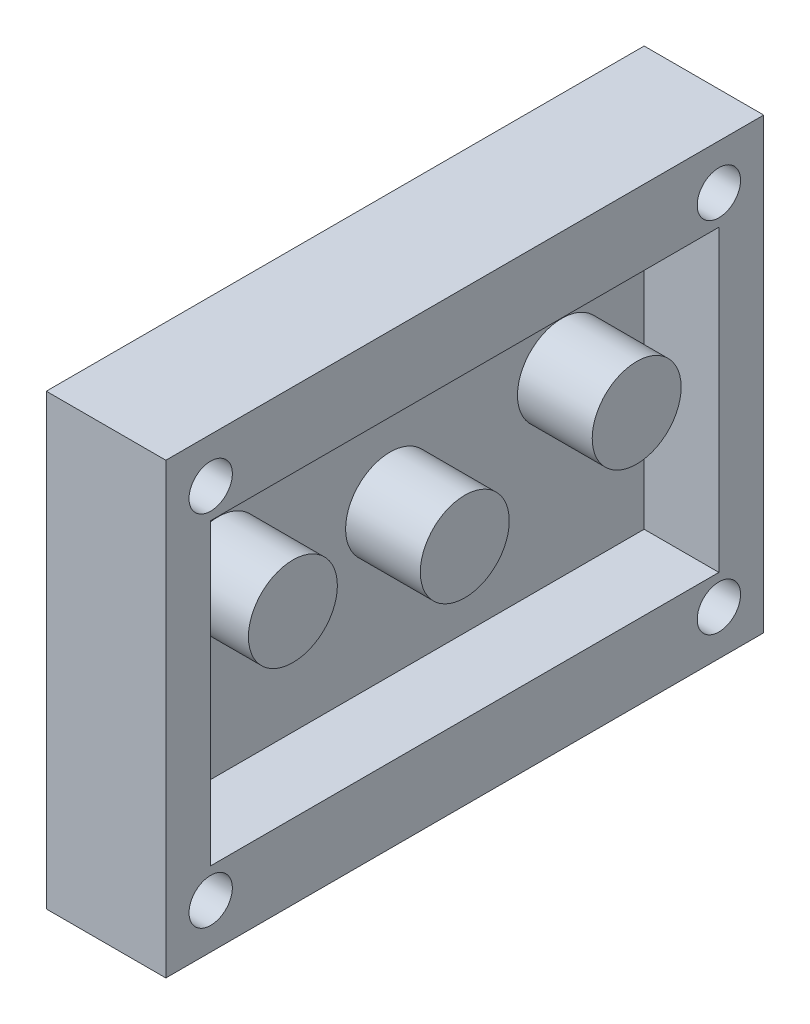
ISO-10303-21;
HEADER;
FILE_DESCRIPTION(('STEP AP214'),'2;1');
FILE_NAME('part.step','',(''),(''),'','','');
FILE_SCHEMA(('AUTOMOTIVE_DESIGN { 1 0 10303 214 1 1 1 1 }'));
ENDSEC;
DATA;
#1=APPLICATION_CONTEXT('core data for automotive mechanical design processes');
#2=APPLICATION_PROTOCOL_DEFINITION('international standard','automotive_design',2000,#1);
#3=PRODUCT_CONTEXT('',#1,'mechanical');
#4=PRODUCT('Part','Part','',(#3));
#5=PRODUCT_RELATED_PRODUCT_CATEGORY('part','',(#4));
#6=PRODUCT_DEFINITION_FORMATION('','',#4);
#7=PRODUCT_DEFINITION_CONTEXT('part definition',#1,'design');
#8=PRODUCT_DEFINITION('design','',#6,#7);
#9=PRODUCT_DEFINITION_SHAPE('','',#8);
#10=(LENGTH_UNIT() NAMED_UNIT(*) SI_UNIT(.MILLI.,.METRE.));
#11=(NAMED_UNIT(*) PLANE_ANGLE_UNIT() SI_UNIT($,.RADIAN.));
#12=(NAMED_UNIT(*) SI_UNIT($,.STERADIAN.) SOLID_ANGLE_UNIT());
#13=UNCERTAINTY_MEASURE_WITH_UNIT(LENGTH_MEASURE(1.E-05),#10,'distance_accuracy_value','');
#14=(GEOMETRIC_REPRESENTATION_CONTEXT(3) GLOBAL_UNCERTAINTY_ASSIGNED_CONTEXT((#13)) GLOBAL_UNIT_ASSIGNED_CONTEXT((#10,
#11,#12)) REPRESENTATION_CONTEXT('',''));
#15=CARTESIAN_POINT('',(0.,0.,0.));
#16=DIRECTION('',(0.,0.,1.));
#17=DIRECTION('',(1.,0.,0.));
#18=AXIS2_PLACEMENT_3D('',#15,#16,#17);
#19=CARTESIAN_POINT('',(8.,0.,0.));
#20=DIRECTION('',(0.,0.,-1.));
#21=DIRECTION('',(-1.,0.,0.));
#22=AXIS2_PLACEMENT_3D('',#19,#20,#21);
#23=PLANE('',#22);
#24=DIRECTION('',(0.,-1.,0.));
#25=VECTOR('',#24,1.);
#26=CARTESIAN_POINT('',(0.,0.,0.));
#27=LINE('',#26,#25);
#28=CARTESIAN_POINT('',(0.,30.,0.));
#29=VERTEX_POINT('',#28);
#30=CARTESIAN_POINT('',(0.,0.,0.));
#31=VERTEX_POINT('',#30);
#32=EDGE_CURVE('E152',#29,#31,#27,.T.);
#33=ORIENTED_EDGE('',*,*,#32,.T.);
#34=DIRECTION('',(-1.,0.,0.));
#35=VECTOR('',#34,1.);
#36=CARTESIAN_POINT('',(8.,0.,0.));
#37=LINE('',#36,#35);
#38=CARTESIAN_POINT('',(8.,0.,0.));
#39=VERTEX_POINT('',#38);
#40=EDGE_CURVE('E176',#39,#31,#37,.T.);
#41=ORIENTED_EDGE('',*,*,#40,.F.);
#42=DIRECTION('',(0.,-1.,0.));
#43=VECTOR('',#42,1.);
#44=CARTESIAN_POINT('',(8.,0.,0.));
#45=LINE('',#44,#43);
#46=CARTESIAN_POINT('',(8.,30.,0.));
#47=VERTEX_POINT('',#46);
#48=EDGE_CURVE('E156',#47,#39,#45,.T.);
#49=ORIENTED_EDGE('',*,*,#48,.F.);
#50=DIRECTION('',(-1.,0.,0.));
#51=VECTOR('',#50,1.);
#52=CARTESIAN_POINT('',(8.,30.,0.));
#53=LINE('',#52,#51);
#54=EDGE_CURVE('E162',#47,#29,#53,.T.);
#55=ORIENTED_EDGE('',*,*,#54,.T.);
#56=EDGE_LOOP('',(#33,#41,#49,#55));
#57=FACE_BOUND('',#56,.T.);
#58=ADVANCED_FACE('F39',(#57),#23,.F.);
#59=CARTESIAN_POINT('',(8.,0.,0.));
#60=DIRECTION('',(0.,1.,0.));
#61=DIRECTION('',(0.,0.,1.));
#62=AXIS2_PLACEMENT_3D('',#59,#60,#61);
#63=PLANE('',#62);
#64=DIRECTION('',(0.,0.,-1.));
#65=VECTOR('',#64,1.);
#66=CARTESIAN_POINT('',(0.,0.,0.));
#67=LINE('',#66,#65);
#68=CARTESIAN_POINT('',(0.,0.,-40.));
#69=VERTEX_POINT('',#68);
#70=EDGE_CURVE('E165',#31,#69,#67,.T.);
#71=ORIENTED_EDGE('',*,*,#70,.T.);
#72=DIRECTION('',(-1.,0.,0.));
#73=VECTOR('',#72,1.);
#74=CARTESIAN_POINT('',(8.,0.,-40.));
#75=LINE('',#74,#73);
#76=CARTESIAN_POINT('',(8.,0.,-40.));
#77=VERTEX_POINT('',#76);
#78=EDGE_CURVE('E173',#77,#69,#75,.T.);
#79=ORIENTED_EDGE('',*,*,#78,.F.);
#80=DIRECTION('',(0.,0.,-1.));
#81=VECTOR('',#80,1.);
#82=CARTESIAN_POINT('',(8.,0.,0.));
#83=LINE('',#82,#81);
#84=EDGE_CURVE('E91',#39,#77,#83,.T.);
#85=ORIENTED_EDGE('',*,*,#84,.F.);
#86=ORIENTED_EDGE('',*,*,#40,.T.);
#87=EDGE_LOOP('',(#71,#79,#85,#86));
#88=FACE_BOUND('',#87,.T.);
#89=ADVANCED_FACE('F210',(#88),#63,.F.);
#90=CARTESIAN_POINT('',(8.,30.,-40.));
#91=DIRECTION('',(0.,0.,1.));
#92=DIRECTION('',(1.,0.,0.));
#93=AXIS2_PLACEMENT_3D('',#90,#91,#92);
#94=PLANE('',#93);
#95=DIRECTION('',(0.,1.,0.));
#96=VECTOR('',#95,1.);
#97=CARTESIAN_POINT('',(0.,30.,-40.));
#98=LINE('',#97,#96);
#99=CARTESIAN_POINT('',(0.,30.,-40.));
#100=VERTEX_POINT('',#99);
#101=EDGE_CURVE('E167',#69,#100,#98,.T.);
#102=ORIENTED_EDGE('',*,*,#101,.T.);
#103=DIRECTION('',(-1.,0.,0.));
#104=VECTOR('',#103,1.);
#105=CARTESIAN_POINT('',(8.,30.,-40.));
#106=LINE('',#105,#104);
#107=CARTESIAN_POINT('',(8.,30.,-40.));
#108=VERTEX_POINT('',#107);
#109=EDGE_CURVE('E171',#108,#100,#106,.T.);
#110=ORIENTED_EDGE('',*,*,#109,.F.);
#111=DIRECTION('',(0.,1.,0.));
#112=VECTOR('',#111,1.);
#113=CARTESIAN_POINT('',(8.,30.,-40.));
#114=LINE('',#113,#112);
#115=EDGE_CURVE('E159',#77,#108,#114,.T.);
#116=ORIENTED_EDGE('',*,*,#115,.F.);
#117=ORIENTED_EDGE('',*,*,#78,.T.);
#118=EDGE_LOOP('',(#102,#110,#116,#117));
#119=FACE_BOUND('',#118,.T.);
#120=ADVANCED_FACE('F215',(#119),#94,.F.);
#121=CARTESIAN_POINT('',(8.,30.,0.));
#122=DIRECTION('',(0.,-1.,0.));
#123=DIRECTION('',(0.,0.,-1.));
#124=AXIS2_PLACEMENT_3D('',#121,#122,#123);
#125=PLANE('',#124);
#126=DIRECTION('',(0.,0.,1.));
#127=VECTOR('',#126,1.);
#128=CARTESIAN_POINT('',(0.,30.,0.));
#129=LINE('',#128,#127);
#130=EDGE_CURVE('E83',#100,#29,#129,.T.);
#131=ORIENTED_EDGE('',*,*,#130,.T.);
#132=ORIENTED_EDGE('',*,*,#54,.F.);
#133=DIRECTION('',(0.,0.,1.));
#134=VECTOR('',#133,1.);
#135=CARTESIAN_POINT('',(8.,30.,0.));
#136=LINE('',#135,#134);
#137=EDGE_CURVE('E62',#108,#47,#136,.T.);
#138=ORIENTED_EDGE('',*,*,#137,.F.);
#139=ORIENTED_EDGE('',*,*,#109,.T.);
#140=EDGE_LOOP('',(#131,#132,#138,#139));
#141=FACE_BOUND('',#140,.T.);
#142=ADVANCED_FACE('F227',(#141),#125,.F.);
#143=CARTESIAN_POINT('',(8.,0.,0.));
#144=DIRECTION('',(-1.,0.,0.));
#145=DIRECTION('',(0.,0.,1.));
#146=AXIS2_PLACEMENT_3D('',#143,#144,#145);
#147=PLANE('',#146);
#148=CARTESIAN_POINT('',(8.,3.,-37.));
#149=DIRECTION('',(1.,0.,0.));
#150=DIRECTION('',(0.,0.,-1.));
#151=AXIS2_PLACEMENT_3D('',#148,#149,#150);
#152=CIRCLE('',#151,1.45);
#153=CARTESIAN_POINT('',(8.,3.,-38.45));
#154=VERTEX_POINT('',#153);
#155=EDGE_CURVE('E513',#154,#154,#152,.T.);
#156=ORIENTED_EDGE('',*,*,#155,.F.);
#157=EDGE_LOOP('',(#156));
#158=FACE_BOUND('',#157,.T.);
#159=CARTESIAN_POINT('',(8.,3.,-3.));
#160=DIRECTION('',(1.,0.,0.));
#161=DIRECTION('',(0.,0.,-1.));
#162=AXIS2_PLACEMENT_3D('',#159,#160,#161);
#163=CIRCLE('',#162,1.45);
#164=CARTESIAN_POINT('',(8.,3.,-4.45));
#165=VERTEX_POINT('',#164);
#166=EDGE_CURVE('E508',#165,#165,#163,.T.);
#167=ORIENTED_EDGE('',*,*,#166,.F.);
#168=EDGE_LOOP('',(#167));
#169=FACE_BOUND('',#168,.T.);
#170=CARTESIAN_POINT('',(8.,27.,-3.));
#171=DIRECTION('',(1.,0.,0.));
#172=DIRECTION('',(0.,0.,-1.));
#173=AXIS2_PLACEMENT_3D('',#170,#171,#172);
#174=CIRCLE('',#173,1.45);
#175=CARTESIAN_POINT('',(8.,27.,-4.45));
#176=VERTEX_POINT('',#175);
#177=EDGE_CURVE('E502',#176,#176,#174,.T.);
#178=ORIENTED_EDGE('',*,*,#177,.F.);
#179=EDGE_LOOP('',(#178));
#180=FACE_BOUND('',#179,.T.);
#181=CARTESIAN_POINT('',(8.,27.,-37.));
#182=DIRECTION('',(1.,0.,0.));
#183=DIRECTION('',(0.,0.,-1.));
#184=AXIS2_PLACEMENT_3D('',#181,#182,#183);
#185=CIRCLE('',#184,1.45);
#186=CARTESIAN_POINT('',(8.,27.,-38.45));
#187=VERTEX_POINT('',#186);
#188=EDGE_CURVE('E146',#187,#187,#185,.T.);
#189=ORIENTED_EDGE('',*,*,#188,.F.);
#190=EDGE_LOOP('',(#189));
#191=FACE_BOUND('',#190,.T.);
#192=DIRECTION('',(0.,0.,1.));
#193=VECTOR('',#192,1.);
#194=CARTESIAN_POINT('',(8.,25.,-3.));
#195=LINE('',#194,#193);
#196=CARTESIAN_POINT('',(8.,25.,-37.));
#197=VERTEX_POINT('',#196);
#198=CARTESIAN_POINT('',(8.,25.,-3.));
#199=VERTEX_POINT('',#198);
#200=EDGE_CURVE('E145',#197,#199,#195,.T.);
#201=ORIENTED_EDGE('',*,*,#200,.F.);
#202=DIRECTION('',(0.,1.,0.));
#203=VECTOR('',#202,1.);
#204=CARTESIAN_POINT('',(8.,5.,-37.));
#205=LINE('',#204,#203);
#206=CARTESIAN_POINT('',(8.,5.,-37.));
#207=VERTEX_POINT('',#206);
#208=EDGE_CURVE('E53',#207,#197,#205,.T.);
#209=ORIENTED_EDGE('',*,*,#208,.F.);
#210=DIRECTION('',(0.,0.,-1.));
#211=VECTOR('',#210,1.);
#212=CARTESIAN_POINT('',(8.,5.,-3.));
#213=LINE('',#212,#211);
#214=CARTESIAN_POINT('',(8.,5.,-3.));
#215=VERTEX_POINT('',#214);
#216=EDGE_CURVE('E133',#215,#207,#213,.T.);
#217=ORIENTED_EDGE('',*,*,#216,.F.);
#218=DIRECTION('',(0.,-1.,0.));
#219=VECTOR('',#218,1.);
#220=CARTESIAN_POINT('',(8.,5.,-3.));
#221=LINE('',#220,#219);
#222=EDGE_CURVE('E136',#199,#215,#221,.T.);
#223=ORIENTED_EDGE('',*,*,#222,.F.);
#224=EDGE_LOOP('',(#201,#209,#217,#223));
#225=FACE_BOUND('',#224,.T.);
#226=ORIENTED_EDGE('',*,*,#48,.T.);
#227=ORIENTED_EDGE('',*,*,#84,.T.);
#228=ORIENTED_EDGE('',*,*,#115,.T.);
#229=ORIENTED_EDGE('',*,*,#137,.T.);
#230=EDGE_LOOP('',(#226,#227,#228,#229));
#231=FACE_BOUND('',#230,.T.);
#232=ADVANCED_FACE('F225',(#158,#169,#180,#191,#225,#231),#147,.F.);
#233=CARTESIAN_POINT('',(0.,0.,0.));
#234=DIRECTION('',(-1.,0.,0.));
#235=DIRECTION('',(0.,0.,1.));
#236=AXIS2_PLACEMENT_3D('',#233,#234,#235);
#237=PLANE('',#236);
#238=ORIENTED_EDGE('',*,*,#32,.F.);
#239=ORIENTED_EDGE('',*,*,#130,.F.);
#240=ORIENTED_EDGE('',*,*,#101,.F.);
#241=ORIENTED_EDGE('',*,*,#70,.F.);
#242=EDGE_LOOP('',(#238,#239,#240,#241));
#243=FACE_BOUND('',#242,.T.);
#244=ADVANCED_FACE('F220',(#243),#237,.T.);
#245=CARTESIAN_POINT('',(3.,5.,-37.));
#246=DIRECTION('',(0.,0.,-1.));
#247=DIRECTION('',(-1.,0.,0.));
#248=AXIS2_PLACEMENT_3D('',#245,#246,#247);
#249=PLANE('',#248);
#250=ORIENTED_EDGE('',*,*,#208,.T.);
#251=DIRECTION('',(1.,0.,0.));
#252=VECTOR('',#251,1.);
#253=CARTESIAN_POINT('',(3.,25.,-37.));
#254=LINE('',#253,#252);
#255=CARTESIAN_POINT('',(3.,25.,-37.));
#256=VERTEX_POINT('',#255);
#257=EDGE_CURVE('E111',#256,#197,#254,.T.);
#258=ORIENTED_EDGE('',*,*,#257,.F.);
#259=DIRECTION('',(0.,1.,0.));
#260=VECTOR('',#259,1.);
#261=CARTESIAN_POINT('',(3.,5.,-37.));
#262=LINE('',#261,#260);
#263=CARTESIAN_POINT('',(3.,5.,-37.));
#264=VERTEX_POINT('',#263);
#265=EDGE_CURVE('E115',#264,#256,#262,.T.);
#266=ORIENTED_EDGE('',*,*,#265,.F.);
#267=DIRECTION('',(1.,0.,0.));
#268=VECTOR('',#267,1.);
#269=CARTESIAN_POINT('',(3.,5.,-37.));
#270=LINE('',#269,#268);
#271=EDGE_CURVE('E150',#264,#207,#270,.T.);
#272=ORIENTED_EDGE('',*,*,#271,.T.);
#273=EDGE_LOOP('',(#250,#258,#266,#272));
#274=FACE_BOUND('',#273,.T.);
#275=ADVANCED_FACE('F113',(#274),#249,.F.);
#276=CARTESIAN_POINT('',(3.,5.,-3.));
#277=DIRECTION('',(0.,-1.,0.));
#278=DIRECTION('',(0.,0.,-1.));
#279=AXIS2_PLACEMENT_3D('',#276,#277,#278);
#280=PLANE('',#279);
#281=ORIENTED_EDGE('',*,*,#216,.T.);
#282=ORIENTED_EDGE('',*,*,#271,.F.);
#283=DIRECTION('',(0.,0.,-1.));
#284=VECTOR('',#283,1.);
#285=CARTESIAN_POINT('',(3.,5.,-3.));
#286=LINE('',#285,#284);
#287=CARTESIAN_POINT('',(3.,5.,-3.));
#288=VERTEX_POINT('',#287);
#289=EDGE_CURVE('E121',#288,#264,#286,.T.);
#290=ORIENTED_EDGE('',*,*,#289,.F.);
#291=DIRECTION('',(1.,0.,0.));
#292=VECTOR('',#291,1.);
#293=CARTESIAN_POINT('',(3.,5.,-3.));
#294=LINE('',#293,#292);
#295=EDGE_CURVE('E153',#288,#215,#294,.T.);
#296=ORIENTED_EDGE('',*,*,#295,.T.);
#297=EDGE_LOOP('',(#281,#282,#290,#296));
#298=FACE_BOUND('',#297,.T.);
#299=ADVANCED_FACE('F272',(#298),#280,.F.);
#300=CARTESIAN_POINT('',(3.,5.,-3.));
#301=DIRECTION('',(0.,0.,1.));
#302=DIRECTION('',(1.,0.,0.));
#303=AXIS2_PLACEMENT_3D('',#300,#301,#302);
#304=PLANE('',#303);
#305=ORIENTED_EDGE('',*,*,#222,.T.);
#306=ORIENTED_EDGE('',*,*,#295,.F.);
#307=DIRECTION('',(0.,-1.,0.));
#308=VECTOR('',#307,1.);
#309=CARTESIAN_POINT('',(3.,5.,-3.));
#310=LINE('',#309,#308);
#311=CARTESIAN_POINT('',(3.,25.,-3.));
#312=VERTEX_POINT('',#311);
#313=EDGE_CURVE('E129',#312,#288,#310,.T.);
#314=ORIENTED_EDGE('',*,*,#313,.F.);
#315=DIRECTION('',(1.,0.,0.));
#316=VECTOR('',#315,1.);
#317=CARTESIAN_POINT('',(3.,25.,-3.));
#318=LINE('',#317,#316);
#319=EDGE_CURVE('E120',#312,#199,#318,.T.);
#320=ORIENTED_EDGE('',*,*,#319,.T.);
#321=EDGE_LOOP('',(#305,#306,#314,#320));
#322=FACE_BOUND('',#321,.T.);
#323=ADVANCED_FACE('F281',(#322),#304,.F.);
#324=CARTESIAN_POINT('',(3.,25.,-3.));
#325=DIRECTION('',(0.,1.,0.));
#326=DIRECTION('',(0.,0.,1.));
#327=AXIS2_PLACEMENT_3D('',#324,#325,#326);
#328=PLANE('',#327);
#329=ORIENTED_EDGE('',*,*,#200,.T.);
#330=ORIENTED_EDGE('',*,*,#319,.F.);
#331=DIRECTION('',(0.,0.,1.));
#332=VECTOR('',#331,1.);
#333=CARTESIAN_POINT('',(3.,25.,-3.));
#334=LINE('',#333,#332);
#335=EDGE_CURVE('E124',#256,#312,#334,.T.);
#336=ORIENTED_EDGE('',*,*,#335,.F.);
#337=ORIENTED_EDGE('',*,*,#257,.T.);
#338=EDGE_LOOP('',(#329,#330,#336,#337));
#339=FACE_BOUND('',#338,.T.);
#340=ADVANCED_FACE('F125',(#339),#328,.F.);
#341=CARTESIAN_POINT('',(3.,0.,0.));
#342=DIRECTION('',(-1.,0.,0.));
#343=DIRECTION('',(0.,0.,1.));
#344=AXIS2_PLACEMENT_3D('',#341,#342,#343);
#345=PLANE('',#344);
#346=CARTESIAN_POINT('',(3.,17.,-31.5));
#347=DIRECTION('',(-1.,0.,0.));
#348=DIRECTION('',(0.,0.,1.));
#349=AXIS2_PLACEMENT_3D('',#346,#347,#348);
#350=CIRCLE('',#349,2.975);
#351=CARTESIAN_POINT('',(3.,17.,-28.525));
#352=VERTEX_POINT('',#351);
#353=EDGE_CURVE('E11',#352,#352,#350,.F.);
#354=ORIENTED_EDGE('',*,*,#353,.F.);
#355=EDGE_LOOP('',(#354));
#356=FACE_BOUND('',#355,.T.);
#357=CARTESIAN_POINT('',(3.,15.,-20.));
#358=DIRECTION('',(-1.,0.,0.));
#359=DIRECTION('',(0.,0.,1.));
#360=AXIS2_PLACEMENT_3D('',#357,#358,#359);
#361=CIRCLE('',#360,2.975);
#362=CARTESIAN_POINT('',(3.,15.,-17.025));
#363=VERTEX_POINT('',#362);
#364=EDGE_CURVE('E46',#363,#363,#361,.F.);
#365=ORIENTED_EDGE('',*,*,#364,.F.);
#366=EDGE_LOOP('',(#365));
#367=FACE_BOUND('',#366,.T.);
#368=CARTESIAN_POINT('',(3.,17.,-8.5));
#369=DIRECTION('',(-1.,0.,0.));
#370=DIRECTION('',(0.,0.,1.));
#371=AXIS2_PLACEMENT_3D('',#368,#369,#370);
#372=CIRCLE('',#371,2.975);
#373=CARTESIAN_POINT('',(3.,17.,-5.525));
#374=VERTEX_POINT('',#373);
#375=EDGE_CURVE('E178',#374,#374,#372,.F.);
#376=ORIENTED_EDGE('',*,*,#375,.F.);
#377=EDGE_LOOP('',(#376));
#378=FACE_BOUND('',#377,.T.);
#379=ORIENTED_EDGE('',*,*,#265,.T.);
#380=ORIENTED_EDGE('',*,*,#335,.T.);
#381=ORIENTED_EDGE('',*,*,#313,.T.);
#382=ORIENTED_EDGE('',*,*,#289,.T.);
#383=EDGE_LOOP('',(#379,#380,#381,#382));
#384=FACE_BOUND('',#383,.T.);
#385=ADVANCED_FACE('F131',(#356,#367,#378,#384),#345,.F.);
#386=CARTESIAN_POINT('',(3.,27.,-37.));
#387=DIRECTION('',(1.,0.,0.));
#388=DIRECTION('',(0.,0.,-1.));
#389=AXIS2_PLACEMENT_3D('',#386,#387,#388);
#390=CYLINDRICAL_SURFACE('',#389,1.45);
#391=CARTESIAN_POINT('',(3.,27.,-37.));
#392=DIRECTION('',(1.,0.,0.));
#393=DIRECTION('',(0.,0.,-1.));
#394=AXIS2_PLACEMENT_3D('',#391,#392,#393);
#395=CIRCLE('',#394,1.45);
#396=CARTESIAN_POINT('',(3.,27.,-38.45));
#397=VERTEX_POINT('',#396);
#398=EDGE_CURVE('E499',#397,#397,#395,.T.);
#399=ORIENTED_EDGE('',*,*,#398,.F.);
#400=EDGE_LOOP('',(#399));
#401=FACE_BOUND('',#400,.T.);
#402=ORIENTED_EDGE('',*,*,#188,.T.);
#403=EDGE_LOOP('',(#402));
#404=FACE_BOUND('',#403,.T.);
#405=ADVANCED_FACE('F187',(#401,#404),#390,.F.);
#406=CARTESIAN_POINT('',(3.,27.,-37.));
#407=DIRECTION('',(1.,0.,0.));
#408=DIRECTION('',(0.,0.,-1.));
#409=AXIS2_PLACEMENT_3D('',#406,#407,#408);
#410=PLANE('',#409);
#411=ORIENTED_EDGE('',*,*,#398,.T.);
#412=EDGE_LOOP('',(#411));
#413=FACE_BOUND('',#412,.T.);
#414=ADVANCED_FACE('F311',(#413),#410,.T.);
#415=CARTESIAN_POINT('',(3.,27.,-3.));
#416=DIRECTION('',(1.,0.,0.));
#417=DIRECTION('',(0.,0.,-1.));
#418=AXIS2_PLACEMENT_3D('',#415,#416,#417);
#419=CYLINDRICAL_SURFACE('',#418,1.45);
#420=CARTESIAN_POINT('',(3.,27.,-3.));
#421=DIRECTION('',(1.,0.,0.));
#422=DIRECTION('',(0.,0.,-1.));
#423=AXIS2_PLACEMENT_3D('',#420,#421,#422);
#424=CIRCLE('',#423,1.45);
#425=CARTESIAN_POINT('',(3.,27.,-4.45));
#426=VERTEX_POINT('',#425);
#427=EDGE_CURVE('E505',#426,#426,#424,.T.);
#428=ORIENTED_EDGE('',*,*,#427,.F.);
#429=EDGE_LOOP('',(#428));
#430=FACE_BOUND('',#429,.T.);
#431=ORIENTED_EDGE('',*,*,#177,.T.);
#432=EDGE_LOOP('',(#431));
#433=FACE_BOUND('',#432,.T.);
#434=ADVANCED_FACE('F321',(#430,#433),#419,.F.);
#435=CARTESIAN_POINT('',(3.,27.,-3.));
#436=DIRECTION('',(1.,0.,0.));
#437=DIRECTION('',(0.,0.,-1.));
#438=AXIS2_PLACEMENT_3D('',#435,#436,#437);
#439=PLANE('',#438);
#440=ORIENTED_EDGE('',*,*,#427,.T.);
#441=EDGE_LOOP('',(#440));
#442=FACE_BOUND('',#441,.T.);
#443=ADVANCED_FACE('F332',(#442),#439,.T.);
#444=CARTESIAN_POINT('',(3.,3.,-3.));
#445=DIRECTION('',(1.,0.,0.));
#446=DIRECTION('',(0.,0.,-1.));
#447=AXIS2_PLACEMENT_3D('',#444,#445,#446);
#448=CYLINDRICAL_SURFACE('',#447,1.45);
#449=CARTESIAN_POINT('',(3.,3.,-3.));
#450=DIRECTION('',(1.,0.,0.));
#451=DIRECTION('',(0.,0.,-1.));
#452=AXIS2_PLACEMENT_3D('',#449,#450,#451);
#453=CIRCLE('',#452,1.45);
#454=CARTESIAN_POINT('',(3.,3.,-4.45));
#455=VERTEX_POINT('',#454);
#456=EDGE_CURVE('E511',#455,#455,#453,.T.);
#457=ORIENTED_EDGE('',*,*,#456,.F.);
#458=EDGE_LOOP('',(#457));
#459=FACE_BOUND('',#458,.T.);
#460=ORIENTED_EDGE('',*,*,#166,.T.);
#461=EDGE_LOOP('',(#460));
#462=FACE_BOUND('',#461,.T.);
#463=ADVANCED_FACE('F343',(#459,#462),#448,.F.);
#464=CARTESIAN_POINT('',(3.,3.,-3.));
#465=DIRECTION('',(1.,0.,0.));
#466=DIRECTION('',(0.,0.,-1.));
#467=AXIS2_PLACEMENT_3D('',#464,#465,#466);
#468=PLANE('',#467);
#469=ORIENTED_EDGE('',*,*,#456,.T.);
#470=EDGE_LOOP('',(#469));
#471=FACE_BOUND('',#470,.T.);
#472=ADVANCED_FACE('F354',(#471),#468,.T.);
#473=CARTESIAN_POINT('',(3.,3.,-37.));
#474=DIRECTION('',(1.,0.,0.));
#475=DIRECTION('',(0.,0.,-1.));
#476=AXIS2_PLACEMENT_3D('',#473,#474,#475);
#477=CYLINDRICAL_SURFACE('',#476,1.45);
#478=CARTESIAN_POINT('',(3.,3.,-37.));
#479=DIRECTION('',(1.,0.,0.));
#480=DIRECTION('',(0.,0.,-1.));
#481=AXIS2_PLACEMENT_3D('',#478,#479,#480);
#482=CIRCLE('',#481,1.45);
#483=CARTESIAN_POINT('',(3.,3.,-38.45));
#484=VERTEX_POINT('',#483);
#485=EDGE_CURVE('E139',#484,#484,#482,.T.);
#486=ORIENTED_EDGE('',*,*,#485,.F.);
#487=EDGE_LOOP('',(#486));
#488=FACE_BOUND('',#487,.T.);
#489=ORIENTED_EDGE('',*,*,#155,.T.);
#490=EDGE_LOOP('',(#489));
#491=FACE_BOUND('',#490,.T.);
#492=ADVANCED_FACE('F204',(#488,#491),#477,.F.);
#493=CARTESIAN_POINT('',(3.,3.,-37.));
#494=DIRECTION('',(1.,0.,0.));
#495=DIRECTION('',(0.,0.,-1.));
#496=AXIS2_PLACEMENT_3D('',#493,#494,#495);
#497=PLANE('',#496);
#498=ORIENTED_EDGE('',*,*,#485,.T.);
#499=EDGE_LOOP('',(#498));
#500=FACE_BOUND('',#499,.T.);
#501=ADVANCED_FACE('F195',(#500),#497,.T.);
#502=CARTESIAN_POINT('',(8.,17.,-8.5));
#503=DIRECTION('',(-1.,0.,0.));
#504=DIRECTION('',(0.,0.,1.));
#505=AXIS2_PLACEMENT_3D('',#502,#503,#504);
#506=CYLINDRICAL_SURFACE('',#505,2.975);
#507=CARTESIAN_POINT('',(8.,17.,-8.5));
#508=DIRECTION('',(1.,0.,0.));
#509=DIRECTION('',(0.,0.,-1.));
#510=AXIS2_PLACEMENT_3D('',#507,#508,#509);
#511=CIRCLE('',#510,2.975);
#512=CARTESIAN_POINT('',(8.,17.,-11.475));
#513=VERTEX_POINT('',#512);
#514=EDGE_CURVE('E492',#513,#513,#511,.T.);
#515=ORIENTED_EDGE('',*,*,#514,.F.);
#516=EDGE_LOOP('',(#515));
#517=FACE_BOUND('',#516,.T.);
#518=ORIENTED_EDGE('',*,*,#375,.T.);
#519=EDGE_LOOP('',(#518));
#520=FACE_BOUND('',#519,.T.);
#521=ADVANCED_FACE('F192',(#517,#520),#506,.T.);
#522=CARTESIAN_POINT('',(8.,17.,-8.5));
#523=DIRECTION('',(1.,0.,0.));
#524=DIRECTION('',(0.,0.,-1.));
#525=AXIS2_PLACEMENT_3D('',#522,#523,#524);
#526=PLANE('',#525);
#527=ORIENTED_EDGE('',*,*,#514,.T.);
#528=EDGE_LOOP('',(#527));
#529=FACE_BOUND('',#528,.T.);
#530=ADVANCED_FACE('F194',(#529),#526,.T.);
#531=CARTESIAN_POINT('',(8.,15.,-20.));
#532=DIRECTION('',(-1.,0.,0.));
#533=DIRECTION('',(0.,0.,1.));
#534=AXIS2_PLACEMENT_3D('',#531,#532,#533);
#535=CYLINDRICAL_SURFACE('',#534,2.975);
#536=CARTESIAN_POINT('',(8.,15.,-20.));
#537=DIRECTION('',(1.,0.,0.));
#538=DIRECTION('',(0.,0.,-1.));
#539=AXIS2_PLACEMENT_3D('',#536,#537,#538);
#540=CIRCLE('',#539,2.975);
#541=CARTESIAN_POINT('',(8.,15.,-22.975));
#542=VERTEX_POINT('',#541);
#543=EDGE_CURVE('E489',#542,#542,#540,.T.);
#544=ORIENTED_EDGE('',*,*,#543,.F.);
#545=EDGE_LOOP('',(#544));
#546=FACE_BOUND('',#545,.T.);
#547=ORIENTED_EDGE('',*,*,#364,.T.);
#548=EDGE_LOOP('',(#547));
#549=FACE_BOUND('',#548,.T.);
#550=ADVANCED_FACE('F183',(#546,#549),#535,.T.);
#551=CARTESIAN_POINT('',(8.,15.,-20.));
#552=DIRECTION('',(1.,0.,0.));
#553=DIRECTION('',(0.,0.,-1.));
#554=AXIS2_PLACEMENT_3D('',#551,#552,#553);
#555=PLANE('',#554);
#556=ORIENTED_EDGE('',*,*,#543,.T.);
#557=EDGE_LOOP('',(#556));
#558=FACE_BOUND('',#557,.T.);
#559=ADVANCED_FACE('F410',(#558),#555,.T.);
#560=CARTESIAN_POINT('',(8.,17.,-31.5));
#561=DIRECTION('',(-1.,0.,0.));
#562=DIRECTION('',(0.,0.,1.));
#563=AXIS2_PLACEMENT_3D('',#560,#561,#562);
#564=CYLINDRICAL_SURFACE('',#563,2.975);
#565=CARTESIAN_POINT('',(8.,17.,-31.5));
#566=DIRECTION('',(1.,0.,0.));
#567=DIRECTION('',(0.,0.,-1.));
#568=AXIS2_PLACEMENT_3D('',#565,#566,#567);
#569=CIRCLE('',#568,2.975);
#570=CARTESIAN_POINT('',(8.,17.,-34.475));
#571=VERTEX_POINT('',#570);
#572=EDGE_CURVE('E488',#571,#571,#569,.T.);
#573=ORIENTED_EDGE('',*,*,#572,.F.);
#574=EDGE_LOOP('',(#573));
#575=FACE_BOUND('',#574,.T.);
#576=ORIENTED_EDGE('',*,*,#353,.T.);
#577=EDGE_LOOP('',(#576));
#578=FACE_BOUND('',#577,.T.);
#579=ADVANCED_FACE('F421',(#575,#578),#564,.T.);
#580=CARTESIAN_POINT('',(8.,17.,-31.5));
#581=DIRECTION('',(1.,0.,0.));
#582=DIRECTION('',(0.,0.,-1.));
#583=AXIS2_PLACEMENT_3D('',#580,#581,#582);
#584=PLANE('',#583);
#585=ORIENTED_EDGE('',*,*,#572,.T.);
#586=EDGE_LOOP('',(#585));
#587=FACE_BOUND('',#586,.T.);
#588=ADVANCED_FACE('F432',(#587),#584,.T.);
#589=CLOSED_SHELL('',(#58,#89,#120,#142,#232,#244,#275,#299,#323,#340,#385,#405,#414,#434,#443,
#463,#472,#492,#501,#521,#530,#550,#559,#579,#588));
#590=MANIFOLD_SOLID_BREP('B2',#589);
#591=ADVANCED_BREP_SHAPE_REPRESENTATION('',(#18,#590),#14);
#592=SHAPE_DEFINITION_REPRESENTATION(#9,#591);
ENDSEC;
END-ISO-10303-21;
